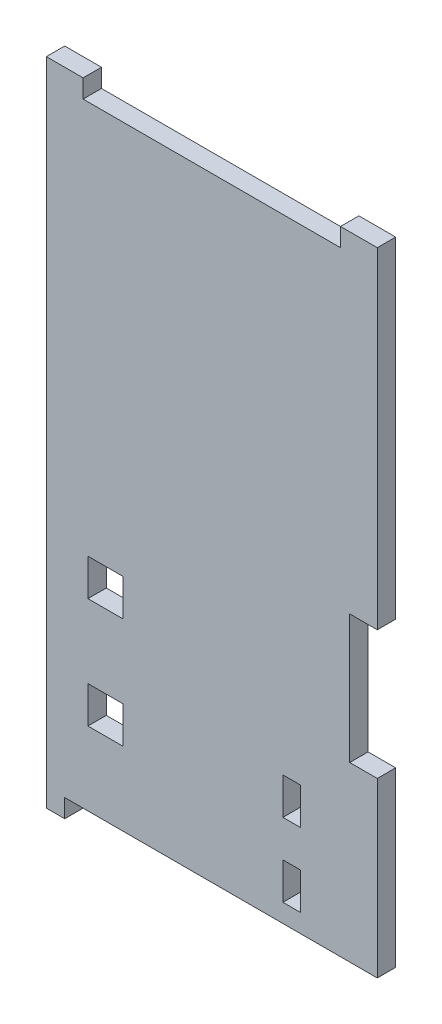
ISO-10303-21;
HEADER;
FILE_DESCRIPTION(('STEP AP214'),'2;1');
FILE_NAME('part.step','',(''),(''),'','','');
FILE_SCHEMA(('AUTOMOTIVE_DESIGN { 1 0 10303 214 1 1 1 1 }'));
ENDSEC;
DATA;
#1=APPLICATION_CONTEXT('core data for automotive mechanical design processes');
#2=APPLICATION_PROTOCOL_DEFINITION('international standard','automotive_design',2000,#1);
#3=PRODUCT_CONTEXT('',#1,'mechanical');
#4=PRODUCT('Part','Part','',(#3));
#5=PRODUCT_RELATED_PRODUCT_CATEGORY('part','',(#4));
#6=PRODUCT_DEFINITION_FORMATION('','',#4);
#7=PRODUCT_DEFINITION_CONTEXT('part definition',#1,'design');
#8=PRODUCT_DEFINITION('design','',#6,#7);
#9=PRODUCT_DEFINITION_SHAPE('','',#8);
#10=(LENGTH_UNIT() NAMED_UNIT(*) SI_UNIT(.MILLI.,.METRE.));
#11=(NAMED_UNIT(*) PLANE_ANGLE_UNIT() SI_UNIT($,.RADIAN.));
#12=(NAMED_UNIT(*) SI_UNIT($,.STERADIAN.) SOLID_ANGLE_UNIT());
#13=UNCERTAINTY_MEASURE_WITH_UNIT(LENGTH_MEASURE(1.E-05),#10,'distance_accuracy_value','');
#14=(GEOMETRIC_REPRESENTATION_CONTEXT(3) GLOBAL_UNCERTAINTY_ASSIGNED_CONTEXT((#13)) GLOBAL_UNIT_ASSIGNED_CONTEXT((#10,
#11,#12)) REPRESENTATION_CONTEXT('',''));
#15=CARTESIAN_POINT('',(0.,0.,0.));
#16=DIRECTION('',(0.,0.,1.));
#17=DIRECTION('',(1.,0.,0.));
#18=AXIS2_PLACEMENT_3D('',#15,#16,#17);
#19=CARTESIAN_POINT('',(0.,0.,5.));
#20=DIRECTION('',(0.,0.,1.));
#21=DIRECTION('',(1.,0.,0.));
#22=AXIS2_PLACEMENT_3D('',#19,#20,#21);
#23=PLANE('',#22);
#24=DIRECTION('',(1.,0.,0.));
#25=VECTOR('',#24,1.);
#26=CARTESIAN_POINT('',(11.3033695588047,19.9999999999951,5.));
#27=LINE('',#26,#25);
#28=CARTESIAN_POINT('',(11.3033695588047,19.9999999999951,5.));
#29=VERTEX_POINT('',#28);
#30=CARTESIAN_POINT('',(20.883176168976,19.9999999999951,5.));
#31=VERTEX_POINT('',#30);
#32=EDGE_CURVE('E268',#29,#31,#27,.T.);
#33=ORIENTED_EDGE('',*,*,#32,.F.);
#34=DIRECTION('',(0.,-1.,0.));
#35=VECTOR('',#34,1.);
#36=CARTESIAN_POINT('',(11.3033695588047,29.9999999999951,5.));
#37=LINE('',#36,#35);
#38=CARTESIAN_POINT('',(11.3033695588047,29.9999999999951,5.));
#39=VERTEX_POINT('',#38);
#40=EDGE_CURVE('E266',#39,#29,#37,.T.);
#41=ORIENTED_EDGE('',*,*,#40,.F.);
#42=DIRECTION('',(-1.,0.,0.));
#43=VECTOR('',#42,1.);
#44=CARTESIAN_POINT('',(11.3033695588047,29.9999999999951,5.));
#45=LINE('',#44,#43);
#46=CARTESIAN_POINT('',(20.883176168976,29.9999999999951,5.));
#47=VERTEX_POINT('',#46);
#48=EDGE_CURVE('E274',#47,#39,#45,.T.);
#49=ORIENTED_EDGE('',*,*,#48,.F.);
#50=DIRECTION('',(0.,1.,0.));
#51=VECTOR('',#50,1.);
#52=CARTESIAN_POINT('',(20.883176168976,29.9999999999951,5.));
#53=LINE('',#52,#51);
#54=EDGE_CURVE('E271',#31,#47,#53,.T.);
#55=ORIENTED_EDGE('',*,*,#54,.F.);
#56=EDGE_LOOP('',(#33,#41,#49,#55));
#57=FACE_BOUND('',#56,.T.);
#58=DIRECTION('',(0.,-1.,0.));
#59=VECTOR('',#58,1.);
#60=CARTESIAN_POINT('',(64.3347547432963,34.9999999999967,5.));
#61=LINE('',#60,#59);
#62=CARTESIAN_POINT('',(64.3347547432963,34.9999999999967,5.));
#63=VERTEX_POINT('',#62);
#64=CARTESIAN_POINT('',(64.3347547432963,24.9999999999967,5.));
#65=VERTEX_POINT('',#64);
#66=EDGE_CURVE('E330',#63,#65,#61,.T.);
#67=ORIENTED_EDGE('',*,*,#66,.F.);
#68=DIRECTION('',(-1.,0.,0.));
#69=VECTOR('',#68,1.);
#70=CARTESIAN_POINT('',(64.3347547432963,34.9999999999967,5.));
#71=LINE('',#70,#69);
#72=CARTESIAN_POINT('',(69.1422875214921,34.9999999999967,5.));
#73=VERTEX_POINT('',#72);
#74=EDGE_CURVE('E328',#73,#63,#71,.T.);
#75=ORIENTED_EDGE('',*,*,#74,.F.);
#76=DIRECTION('',(0.,1.,0.));
#77=VECTOR('',#76,1.);
#78=CARTESIAN_POINT('',(69.1422875214921,34.9999999999967,5.));
#79=LINE('',#78,#77);
#80=CARTESIAN_POINT('',(69.1422875214921,24.9999999999967,5.));
#81=VERTEX_POINT('',#80);
#82=EDGE_CURVE('E336',#81,#73,#79,.T.);
#83=ORIENTED_EDGE('',*,*,#82,.F.);
#84=DIRECTION('',(1.,0.,0.));
#85=VECTOR('',#84,1.);
#86=CARTESIAN_POINT('',(64.3347547432963,24.9999999999967,5.));
#87=LINE('',#86,#85);
#88=EDGE_CURVE('E333',#65,#81,#87,.T.);
#89=ORIENTED_EDGE('',*,*,#88,.F.);
#90=EDGE_LOOP('',(#67,#75,#83,#89));
#91=FACE_BOUND('',#90,.T.);
#92=DIRECTION('',(0.,-1.,0.));
#93=VECTOR('',#92,1.);
#94=CARTESIAN_POINT('',(0.,0.,5.));
#95=LINE('',#94,#93);
#96=CARTESIAN_POINT('',(0.,172.,5.));
#97=VERTEX_POINT('',#96);
#98=CARTESIAN_POINT('',(0.,-5.,5.));
#99=VERTEX_POINT('',#98);
#100=EDGE_CURVE('E359',#97,#99,#95,.T.);
#101=ORIENTED_EDGE('',*,*,#100,.T.);
#102=DIRECTION('',(1.,0.,0.));
#103=VECTOR('',#102,1.);
#104=CARTESIAN_POINT('',(0.,-5.,5.));
#105=LINE('',#104,#103);
#106=CARTESIAN_POINT('',(5.,-5.,5.));
#107=VERTEX_POINT('',#106);
#108=EDGE_CURVE('E362',#99,#107,#105,.T.);
#109=ORIENTED_EDGE('',*,*,#108,.T.);
#110=DIRECTION('',(0.,1.,0.));
#111=VECTOR('',#110,1.);
#112=CARTESIAN_POINT('',(5.,0.,5.));
#113=LINE('',#112,#111);
#114=CARTESIAN_POINT('',(5.,0.,5.));
#115=VERTEX_POINT('',#114);
#116=EDGE_CURVE('E365',#107,#115,#113,.T.);
#117=ORIENTED_EDGE('',*,*,#116,.T.);
#118=DIRECTION('',(1.,0.,0.));
#119=VECTOR('',#118,1.);
#120=CARTESIAN_POINT('',(5.,0.,5.));
#121=LINE('',#120,#119);
#122=CARTESIAN_POINT('',(90.,0.,5.));
#123=VERTEX_POINT('',#122);
#124=EDGE_CURVE('E367',#115,#123,#121,.T.);
#125=ORIENTED_EDGE('',*,*,#124,.T.);
#126=DIRECTION('',(0.,1.,0.));
#127=VECTOR('',#126,1.);
#128=CARTESIAN_POINT('',(90.,0.,5.));
#129=LINE('',#128,#127);
#130=CARTESIAN_POINT('',(90.,47.,5.));
#131=VERTEX_POINT('',#130);
#132=EDGE_CURVE('E369',#123,#131,#129,.T.);
#133=ORIENTED_EDGE('',*,*,#132,.T.);
#134=DIRECTION('',(-1.,0.,0.));
#135=VECTOR('',#134,1.);
#136=CARTESIAN_POINT('',(90.,47.,5.));
#137=LINE('',#136,#135);
#138=CARTESIAN_POINT('',(82.5,47.,5.));
#139=VERTEX_POINT('',#138);
#140=EDGE_CURVE('E371',#131,#139,#137,.T.);
#141=ORIENTED_EDGE('',*,*,#140,.T.);
#142=DIRECTION('',(0.,1.,0.));
#143=VECTOR('',#142,1.);
#144=CARTESIAN_POINT('',(82.5,82.,5.));
#145=LINE('',#144,#143);
#146=CARTESIAN_POINT('',(82.5,82.,5.));
#147=VERTEX_POINT('',#146);
#148=EDGE_CURVE('E373',#139,#147,#145,.T.);
#149=ORIENTED_EDGE('',*,*,#148,.T.);
#150=DIRECTION('',(1.,0.,0.));
#151=VECTOR('',#150,1.);
#152=CARTESIAN_POINT('',(90.,82.,5.));
#153=LINE('',#152,#151);
#154=CARTESIAN_POINT('',(90.,82.,5.));
#155=VERTEX_POINT('',#154);
#156=EDGE_CURVE('E375',#147,#155,#153,.T.);
#157=ORIENTED_EDGE('',*,*,#156,.T.);
#158=DIRECTION('',(0.,1.,0.));
#159=VECTOR('',#158,1.);
#160=CARTESIAN_POINT('',(90.,82.,5.));
#161=LINE('',#160,#159);
#162=CARTESIAN_POINT('',(90.,172.,5.));
#163=VERTEX_POINT('',#162);
#164=EDGE_CURVE('E377',#155,#163,#161,.T.);
#165=ORIENTED_EDGE('',*,*,#164,.T.);
#166=DIRECTION('',(-1.,0.,0.));
#167=VECTOR('',#166,1.);
#168=CARTESIAN_POINT('',(90.,172.,5.));
#169=LINE('',#168,#167);
#170=CARTESIAN_POINT('',(80.,172.,5.));
#171=VERTEX_POINT('',#170);
#172=EDGE_CURVE('E379',#163,#171,#169,.T.);
#173=ORIENTED_EDGE('',*,*,#172,.T.);
#174=DIRECTION('',(0.,-1.,0.));
#175=VECTOR('',#174,1.);
#176=CARTESIAN_POINT('',(80.,167.,5.));
#177=LINE('',#176,#175);
#178=CARTESIAN_POINT('',(80.,167.,5.));
#179=VERTEX_POINT('',#178);
#180=EDGE_CURVE('E381',#171,#179,#177,.T.);
#181=ORIENTED_EDGE('',*,*,#180,.T.);
#182=DIRECTION('',(-1.,0.,0.));
#183=VECTOR('',#182,1.);
#184=CARTESIAN_POINT('',(10.,167.,5.));
#185=LINE('',#184,#183);
#186=CARTESIAN_POINT('',(10.,167.,5.));
#187=VERTEX_POINT('',#186);
#188=EDGE_CURVE('E383',#179,#187,#185,.T.);
#189=ORIENTED_EDGE('',*,*,#188,.T.);
#190=DIRECTION('',(0.,1.,0.));
#191=VECTOR('',#190,1.);
#192=CARTESIAN_POINT('',(10.,167.,5.));
#193=LINE('',#192,#191);
#194=CARTESIAN_POINT('',(10.,172.,5.));
#195=VERTEX_POINT('',#194);
#196=EDGE_CURVE('E385',#187,#195,#193,.T.);
#197=ORIENTED_EDGE('',*,*,#196,.T.);
#198=DIRECTION('',(-1.,0.,0.));
#199=VECTOR('',#198,1.);
#200=CARTESIAN_POINT('',(0.,172.,5.));
#201=LINE('',#200,#199);
#202=EDGE_CURVE('E387',#195,#97,#201,.T.);
#203=ORIENTED_EDGE('',*,*,#202,.T.);
#204=EDGE_LOOP('',(#101,#109,#117,#125,#133,#141,#149,#157,#165,#173,#181,#189,#197,#203));
#205=FACE_BOUND('',#204,.T.);
#206=DIRECTION('',(1.,0.,0.));
#207=VECTOR('',#206,1.);
#208=CARTESIAN_POINT('',(64.3347547432963,4.99999999999675,5.));
#209=LINE('',#208,#207);
#210=CARTESIAN_POINT('',(64.3347547432963,4.99999999999675,5.));
#211=VERTEX_POINT('',#210);
#212=CARTESIAN_POINT('',(69.1422875214921,4.99999999999675,5.));
#213=VERTEX_POINT('',#212);
#214=EDGE_CURVE('E299',#211,#213,#209,.T.);
#215=ORIENTED_EDGE('',*,*,#214,.F.);
#216=DIRECTION('',(0.,-1.,0.));
#217=VECTOR('',#216,1.);
#218=CARTESIAN_POINT('',(64.3347547432963,14.9999999999967,5.));
#219=LINE('',#218,#217);
#220=CARTESIAN_POINT('',(64.3347547432963,14.9999999999967,5.));
#221=VERTEX_POINT('',#220);
#222=EDGE_CURVE('E297',#221,#211,#219,.T.);
#223=ORIENTED_EDGE('',*,*,#222,.F.);
#224=DIRECTION('',(-1.,0.,0.));
#225=VECTOR('',#224,1.);
#226=CARTESIAN_POINT('',(64.3347547432963,14.9999999999967,5.));
#227=LINE('',#226,#225);
#228=CARTESIAN_POINT('',(69.1422875214921,14.9999999999967,5.));
#229=VERTEX_POINT('',#228);
#230=EDGE_CURVE('E305',#229,#221,#227,.T.);
#231=ORIENTED_EDGE('',*,*,#230,.F.);
#232=DIRECTION('',(0.,1.,0.));
#233=VECTOR('',#232,1.);
#234=CARTESIAN_POINT('',(69.1422875214921,14.9999999999967,5.));
#235=LINE('',#234,#233);
#236=EDGE_CURVE('E302',#213,#229,#235,.T.);
#237=ORIENTED_EDGE('',*,*,#236,.F.);
#238=EDGE_LOOP('',(#215,#223,#231,#237));
#239=FACE_BOUND('',#238,.T.);
#240=DIRECTION('',(1.,0.,0.));
#241=VECTOR('',#240,1.);
#242=CARTESIAN_POINT('',(11.3033695588046,49.9999999999951,5.));
#243=LINE('',#242,#241);
#244=CARTESIAN_POINT('',(11.3033695588046,49.9999999999951,5.));
#245=VERTEX_POINT('',#244);
#246=CARTESIAN_POINT('',(20.8831761689759,49.9999999999951,5.));
#247=VERTEX_POINT('',#246);
#248=EDGE_CURVE('E238',#245,#247,#243,.T.);
#249=ORIENTED_EDGE('',*,*,#248,.F.);
#250=DIRECTION('',(0.,-1.,0.));
#251=VECTOR('',#250,1.);
#252=CARTESIAN_POINT('',(11.3033695588046,59.9999999999951,5.));
#253=LINE('',#252,#251);
#254=CARTESIAN_POINT('',(11.3033695588046,59.9999999999951,5.));
#255=VERTEX_POINT('',#254);
#256=EDGE_CURVE('E230',#255,#245,#253,.T.);
#257=ORIENTED_EDGE('',*,*,#256,.F.);
#258=DIRECTION('',(-1.,0.,0.));
#259=VECTOR('',#258,1.);
#260=CARTESIAN_POINT('',(11.3033695588046,59.9999999999951,5.));
#261=LINE('',#260,#259);
#262=CARTESIAN_POINT('',(20.8831761689759,59.9999999999951,5.));
#263=VERTEX_POINT('',#262);
#264=EDGE_CURVE('E252',#263,#255,#261,.T.);
#265=ORIENTED_EDGE('',*,*,#264,.F.);
#266=DIRECTION('',(0.,1.,0.));
#267=VECTOR('',#266,1.);
#268=CARTESIAN_POINT('',(20.8831761689759,59.9999999999951,5.));
#269=LINE('',#268,#267);
#270=EDGE_CURVE('E250',#247,#263,#269,.T.);
#271=ORIENTED_EDGE('',*,*,#270,.F.);
#272=EDGE_LOOP('',(#249,#257,#265,#271));
#273=FACE_BOUND('',#272,.T.);
#274=ADVANCED_FACE('F33',(#57,#91,#205,#239,#273),#23,.T.);
#275=CARTESIAN_POINT('',(0.,0.,0.));
#276=DIRECTION('',(0.,0.,1.));
#277=DIRECTION('',(1.,0.,0.));
#278=AXIS2_PLACEMENT_3D('',#275,#276,#277);
#279=PLANE('',#278);
#280=DIRECTION('',(0.,-1.,0.));
#281=VECTOR('',#280,1.);
#282=CARTESIAN_POINT('',(11.3033695588047,29.9999999999951,0.));
#283=LINE('',#282,#281);
#284=CARTESIAN_POINT('',(11.3033695588047,29.9999999999951,0.));
#285=VERTEX_POINT('',#284);
#286=CARTESIAN_POINT('',(11.3033695588047,19.9999999999951,0.));
#287=VERTEX_POINT('',#286);
#288=EDGE_CURVE('E246',#285,#287,#283,.T.);
#289=ORIENTED_EDGE('',*,*,#288,.T.);
#290=DIRECTION('',(1.,0.,0.));
#291=VECTOR('',#290,1.);
#292=CARTESIAN_POINT('',(11.3033695588047,19.9999999999951,0.));
#293=LINE('',#292,#291);
#294=CARTESIAN_POINT('',(20.883176168976,19.9999999999951,0.));
#295=VERTEX_POINT('',#294);
#296=EDGE_CURVE('E279',#287,#295,#293,.T.);
#297=ORIENTED_EDGE('',*,*,#296,.T.);
#298=DIRECTION('',(0.,1.,0.));
#299=VECTOR('',#298,1.);
#300=CARTESIAN_POINT('',(20.883176168976,29.9999999999951,0.));
#301=LINE('',#300,#299);
#302=CARTESIAN_POINT('',(20.883176168976,29.9999999999951,0.));
#303=VERTEX_POINT('',#302);
#304=EDGE_CURVE('E282',#295,#303,#301,.T.);
#305=ORIENTED_EDGE('',*,*,#304,.T.);
#306=DIRECTION('',(-1.,0.,0.));
#307=VECTOR('',#306,1.);
#308=CARTESIAN_POINT('',(11.3033695588047,29.9999999999951,0.));
#309=LINE('',#308,#307);
#310=EDGE_CURVE('E269',#303,#285,#309,.T.);
#311=ORIENTED_EDGE('',*,*,#310,.T.);
#312=EDGE_LOOP('',(#289,#297,#305,#311));
#313=FACE_BOUND('',#312,.T.);
#314=DIRECTION('',(-1.,0.,0.));
#315=VECTOR('',#314,1.);
#316=CARTESIAN_POINT('',(64.3347547432963,34.9999999999967,0.));
#317=LINE('',#316,#315);
#318=CARTESIAN_POINT('',(69.1422875214921,34.9999999999967,0.));
#319=VERTEX_POINT('',#318);
#320=CARTESIAN_POINT('',(64.3347547432963,34.9999999999967,0.));
#321=VERTEX_POINT('',#320);
#322=EDGE_CURVE('E327',#319,#321,#317,.T.);
#323=ORIENTED_EDGE('',*,*,#322,.T.);
#324=DIRECTION('',(0.,-1.,0.));
#325=VECTOR('',#324,1.);
#326=CARTESIAN_POINT('',(64.3347547432963,34.9999999999967,0.));
#327=LINE('',#326,#325);
#328=CARTESIAN_POINT('',(64.3347547432963,24.9999999999967,0.));
#329=VERTEX_POINT('',#328);
#330=EDGE_CURVE('E341',#321,#329,#327,.T.);
#331=ORIENTED_EDGE('',*,*,#330,.T.);
#332=DIRECTION('',(1.,0.,0.));
#333=VECTOR('',#332,1.);
#334=CARTESIAN_POINT('',(64.3347547432963,24.9999999999967,0.));
#335=LINE('',#334,#333);
#336=CARTESIAN_POINT('',(69.1422875214921,24.9999999999967,0.));
#337=VERTEX_POINT('',#336);
#338=EDGE_CURVE('E344',#329,#337,#335,.T.);
#339=ORIENTED_EDGE('',*,*,#338,.T.);
#340=DIRECTION('',(0.,1.,0.));
#341=VECTOR('',#340,1.);
#342=CARTESIAN_POINT('',(69.1422875214921,34.9999999999967,0.));
#343=LINE('',#342,#341);
#344=EDGE_CURVE('E331',#337,#319,#343,.T.);
#345=ORIENTED_EDGE('',*,*,#344,.T.);
#346=EDGE_LOOP('',(#323,#331,#339,#345));
#347=FACE_BOUND('',#346,.T.);
#348=DIRECTION('',(1.,0.,0.));
#349=VECTOR('',#348,1.);
#350=CARTESIAN_POINT('',(0.,-5.,0.));
#351=LINE('',#350,#349);
#352=CARTESIAN_POINT('',(0.,-5.,0.));
#353=VERTEX_POINT('',#352);
#354=CARTESIAN_POINT('',(5.,-5.,0.));
#355=VERTEX_POINT('',#354);
#356=EDGE_CURVE('E358',#353,#355,#351,.T.);
#357=ORIENTED_EDGE('',*,*,#356,.F.);
#358=DIRECTION('',(0.,-1.,0.));
#359=VECTOR('',#358,1.);
#360=CARTESIAN_POINT('',(0.,0.,0.));
#361=LINE('',#360,#359);
#362=CARTESIAN_POINT('',(0.,172.,0.));
#363=VERTEX_POINT('',#362);
#364=EDGE_CURVE('E363',#363,#353,#361,.T.);
#365=ORIENTED_EDGE('',*,*,#364,.F.);
#366=DIRECTION('',(-1.,0.,0.));
#367=VECTOR('',#366,1.);
#368=CARTESIAN_POINT('',(0.,172.,0.));
#369=LINE('',#368,#367);
#370=CARTESIAN_POINT('',(10.,172.,0.));
#371=VERTEX_POINT('',#370);
#372=EDGE_CURVE('E415',#371,#363,#369,.T.);
#373=ORIENTED_EDGE('',*,*,#372,.F.);
#374=DIRECTION('',(0.,1.,0.));
#375=VECTOR('',#374,1.);
#376=CARTESIAN_POINT('',(10.,167.,0.));
#377=LINE('',#376,#375);
#378=CARTESIAN_POINT('',(10.,167.,0.));
#379=VERTEX_POINT('',#378);
#380=EDGE_CURVE('E413',#379,#371,#377,.T.);
#381=ORIENTED_EDGE('',*,*,#380,.F.);
#382=DIRECTION('',(-1.,0.,0.));
#383=VECTOR('',#382,1.);
#384=CARTESIAN_POINT('',(10.,167.,0.));
#385=LINE('',#384,#383);
#386=CARTESIAN_POINT('',(80.,167.,0.));
#387=VERTEX_POINT('',#386);
#388=EDGE_CURVE('E411',#387,#379,#385,.T.);
#389=ORIENTED_EDGE('',*,*,#388,.F.);
#390=DIRECTION('',(0.,-1.,0.));
#391=VECTOR('',#390,1.);
#392=CARTESIAN_POINT('',(80.,167.,0.));
#393=LINE('',#392,#391);
#394=CARTESIAN_POINT('',(80.,172.,0.));
#395=VERTEX_POINT('',#394);
#396=EDGE_CURVE('E409',#395,#387,#393,.T.);
#397=ORIENTED_EDGE('',*,*,#396,.F.);
#398=DIRECTION('',(-1.,0.,0.));
#399=VECTOR('',#398,1.);
#400=CARTESIAN_POINT('',(90.,172.,0.));
#401=LINE('',#400,#399);
#402=CARTESIAN_POINT('',(90.,172.,0.));
#403=VERTEX_POINT('',#402);
#404=EDGE_CURVE('E407',#403,#395,#401,.T.);
#405=ORIENTED_EDGE('',*,*,#404,.F.);
#406=DIRECTION('',(0.,1.,0.));
#407=VECTOR('',#406,1.);
#408=CARTESIAN_POINT('',(90.,167.,0.));
#409=LINE('',#408,#407);
#410=CARTESIAN_POINT('',(90.,82.,0.));
#411=VERTEX_POINT('',#410);
#412=EDGE_CURVE('E405',#411,#403,#409,.T.);
#413=ORIENTED_EDGE('',*,*,#412,.F.);
#414=DIRECTION('',(1.,0.,0.));
#415=VECTOR('',#414,1.);
#416=CARTESIAN_POINT('',(90.,82.,0.));
#417=LINE('',#416,#415);
#418=CARTESIAN_POINT('',(82.5,82.,0.));
#419=VERTEX_POINT('',#418);
#420=EDGE_CURVE('E402',#419,#411,#417,.T.);
#421=ORIENTED_EDGE('',*,*,#420,.F.);
#422=DIRECTION('',(0.,1.,0.));
#423=VECTOR('',#422,1.);
#424=CARTESIAN_POINT('',(82.5,82.,0.));
#425=LINE('',#424,#423);
#426=CARTESIAN_POINT('',(82.5,47.,0.));
#427=VERTEX_POINT('',#426);
#428=EDGE_CURVE('E400',#427,#419,#425,.T.);
#429=ORIENTED_EDGE('',*,*,#428,.F.);
#430=DIRECTION('',(-1.,0.,0.));
#431=VECTOR('',#430,1.);
#432=CARTESIAN_POINT('',(90.,47.,0.));
#433=LINE('',#432,#431);
#434=CARTESIAN_POINT('',(90.,47.,0.));
#435=VERTEX_POINT('',#434);
#436=EDGE_CURVE('E398',#435,#427,#433,.T.);
#437=ORIENTED_EDGE('',*,*,#436,.F.);
#438=DIRECTION('',(0.,1.,0.));
#439=VECTOR('',#438,1.);
#440=CARTESIAN_POINT('',(90.,0.,0.));
#441=LINE('',#440,#439);
#442=CARTESIAN_POINT('',(90.,0.,0.));
#443=VERTEX_POINT('',#442);
#444=EDGE_CURVE('E396',#443,#435,#441,.T.);
#445=ORIENTED_EDGE('',*,*,#444,.F.);
#446=DIRECTION('',(1.,0.,0.));
#447=VECTOR('',#446,1.);
#448=CARTESIAN_POINT('',(5.,0.,0.));
#449=LINE('',#448,#447);
#450=CARTESIAN_POINT('',(5.,0.,0.));
#451=VERTEX_POINT('',#450);
#452=EDGE_CURVE('E394',#451,#443,#449,.T.);
#453=ORIENTED_EDGE('',*,*,#452,.F.);
#454=DIRECTION('',(0.,1.,0.));
#455=VECTOR('',#454,1.);
#456=CARTESIAN_POINT('',(5.,0.,0.));
#457=LINE('',#456,#455);
#458=EDGE_CURVE('E392',#355,#451,#457,.T.);
#459=ORIENTED_EDGE('',*,*,#458,.F.);
#460=EDGE_LOOP('',(#357,#365,#373,#381,#389,#397,#405,#413,#421,#429,#437,#445,#453,#459));
#461=FACE_BOUND('',#460,.T.);
#462=DIRECTION('',(0.,-1.,0.));
#463=VECTOR('',#462,1.);
#464=CARTESIAN_POINT('',(64.3347547432963,14.9999999999967,0.));
#465=LINE('',#464,#463);
#466=CARTESIAN_POINT('',(64.3347547432963,14.9999999999967,0.));
#467=VERTEX_POINT('',#466);
#468=CARTESIAN_POINT('',(64.3347547432963,4.99999999999675,0.));
#469=VERTEX_POINT('',#468);
#470=EDGE_CURVE('E296',#467,#469,#465,.T.);
#471=ORIENTED_EDGE('',*,*,#470,.T.);
#472=DIRECTION('',(1.,0.,0.));
#473=VECTOR('',#472,1.);
#474=CARTESIAN_POINT('',(64.3347547432963,4.99999999999675,0.));
#475=LINE('',#474,#473);
#476=CARTESIAN_POINT('',(69.1422875214921,4.99999999999675,0.));
#477=VERTEX_POINT('',#476);
#478=EDGE_CURVE('E310',#469,#477,#475,.T.);
#479=ORIENTED_EDGE('',*,*,#478,.T.);
#480=DIRECTION('',(0.,1.,0.));
#481=VECTOR('',#480,1.);
#482=CARTESIAN_POINT('',(69.1422875214921,14.9999999999967,0.));
#483=LINE('',#482,#481);
#484=CARTESIAN_POINT('',(69.1422875214921,14.9999999999967,0.));
#485=VERTEX_POINT('',#484);
#486=EDGE_CURVE('E313',#477,#485,#483,.T.);
#487=ORIENTED_EDGE('',*,*,#486,.T.);
#488=DIRECTION('',(-1.,0.,0.));
#489=VECTOR('',#488,1.);
#490=CARTESIAN_POINT('',(64.3347547432963,14.9999999999967,0.));
#491=LINE('',#490,#489);
#492=EDGE_CURVE('E300',#485,#467,#491,.T.);
#493=ORIENTED_EDGE('',*,*,#492,.T.);
#494=EDGE_LOOP('',(#471,#479,#487,#493));
#495=FACE_BOUND('',#494,.T.);
#496=DIRECTION('',(0.,-1.,0.));
#497=VECTOR('',#496,1.);
#498=CARTESIAN_POINT('',(11.3033695588046,59.9999999999951,0.));
#499=LINE('',#498,#497);
#500=CARTESIAN_POINT('',(11.3033695588046,59.9999999999951,0.));
#501=VERTEX_POINT('',#500);
#502=CARTESIAN_POINT('',(11.3033695588046,49.9999999999951,0.));
#503=VERTEX_POINT('',#502);
#504=EDGE_CURVE('E56',#501,#503,#499,.T.);
#505=ORIENTED_EDGE('',*,*,#504,.T.);
#506=DIRECTION('',(1.,0.,0.));
#507=VECTOR('',#506,1.);
#508=CARTESIAN_POINT('',(11.3033695588046,49.9999999999951,0.));
#509=LINE('',#508,#507);
#510=CARTESIAN_POINT('',(20.8831761689759,49.9999999999951,0.));
#511=VERTEX_POINT('',#510);
#512=EDGE_CURVE('E245',#503,#511,#509,.T.);
#513=ORIENTED_EDGE('',*,*,#512,.T.);
#514=DIRECTION('',(0.,1.,0.));
#515=VECTOR('',#514,1.);
#516=CARTESIAN_POINT('',(20.8831761689759,59.9999999999951,0.));
#517=LINE('',#516,#515);
#518=CARTESIAN_POINT('',(20.8831761689759,59.9999999999951,0.));
#519=VERTEX_POINT('',#518);
#520=EDGE_CURVE('E258',#511,#519,#517,.T.);
#521=ORIENTED_EDGE('',*,*,#520,.T.);
#522=DIRECTION('',(-1.,0.,0.));
#523=VECTOR('',#522,1.);
#524=CARTESIAN_POINT('',(11.3033695588046,59.9999999999951,0.));
#525=LINE('',#524,#523);
#526=EDGE_CURVE('E239',#519,#501,#525,.T.);
#527=ORIENTED_EDGE('',*,*,#526,.T.);
#528=EDGE_LOOP('',(#505,#513,#521,#527));
#529=FACE_BOUND('',#528,.T.);
#530=ADVANCED_FACE('F464',(#313,#347,#461,#495,#529),#279,.F.);
#531=CARTESIAN_POINT('',(0.,-5.,5.));
#532=DIRECTION('',(0.,1.,0.));
#533=DIRECTION('',(0.,0.,1.));
#534=AXIS2_PLACEMENT_3D('',#531,#532,#533);
#535=PLANE('',#534);
#536=ORIENTED_EDGE('',*,*,#356,.T.);
#537=DIRECTION('',(0.,0.,-1.));
#538=VECTOR('',#537,1.);
#539=CARTESIAN_POINT('',(5.,-5.,5.));
#540=LINE('',#539,#538);
#541=EDGE_CURVE('E41',#107,#355,#540,.T.);
#542=ORIENTED_EDGE('',*,*,#541,.F.);
#543=ORIENTED_EDGE('',*,*,#108,.F.);
#544=DIRECTION('',(0.,0.,-1.));
#545=VECTOR('',#544,1.);
#546=CARTESIAN_POINT('',(0.,-5.,5.));
#547=LINE('',#546,#545);
#548=EDGE_CURVE('E11',#99,#353,#547,.T.);
#549=ORIENTED_EDGE('',*,*,#548,.T.);
#550=EDGE_LOOP('',(#536,#542,#543,#549));
#551=FACE_BOUND('',#550,.T.);
#552=ADVANCED_FACE('F35',(#551),#535,.F.);
#553=CARTESIAN_POINT('',(5.,0.,5.));
#554=DIRECTION('',(-1.,0.,0.));
#555=DIRECTION('',(0.,-1.,0.));
#556=AXIS2_PLACEMENT_3D('',#553,#554,#555);
#557=PLANE('',#556);
#558=ORIENTED_EDGE('',*,*,#458,.T.);
#559=DIRECTION('',(0.,0.,-1.));
#560=VECTOR('',#559,1.);
#561=CARTESIAN_POINT('',(5.,0.,5.));
#562=LINE('',#561,#560);
#563=EDGE_CURVE('E451',#115,#451,#562,.T.);
#564=ORIENTED_EDGE('',*,*,#563,.F.);
#565=ORIENTED_EDGE('',*,*,#116,.F.);
#566=ORIENTED_EDGE('',*,*,#541,.T.);
#567=EDGE_LOOP('',(#558,#564,#565,#566));
#568=FACE_BOUND('',#567,.T.);
#569=ADVANCED_FACE('F458',(#568),#557,.F.);
#570=CARTESIAN_POINT('',(5.,0.,5.));
#571=DIRECTION('',(0.,1.,0.));
#572=DIRECTION('',(0.,0.,1.));
#573=AXIS2_PLACEMENT_3D('',#570,#571,#572);
#574=PLANE('',#573);
#575=ORIENTED_EDGE('',*,*,#452,.T.);
#576=DIRECTION('',(0.,0.,-1.));
#577=VECTOR('',#576,1.);
#578=CARTESIAN_POINT('',(90.,0.,5.));
#579=LINE('',#578,#577);
#580=EDGE_CURVE('E448',#123,#443,#579,.T.);
#581=ORIENTED_EDGE('',*,*,#580,.F.);
#582=ORIENTED_EDGE('',*,*,#124,.F.);
#583=ORIENTED_EDGE('',*,*,#563,.T.);
#584=EDGE_LOOP('',(#575,#581,#582,#583));
#585=FACE_BOUND('',#584,.T.);
#586=ADVANCED_FACE('F470',(#585),#574,.F.);
#587=CARTESIAN_POINT('',(90.,0.,5.));
#588=DIRECTION('',(-1.,0.,0.));
#589=DIRECTION('',(0.,0.,1.));
#590=AXIS2_PLACEMENT_3D('',#587,#588,#589);
#591=PLANE('',#590);
#592=ORIENTED_EDGE('',*,*,#444,.T.);
#593=DIRECTION('',(0.,0.,-1.));
#594=VECTOR('',#593,1.);
#595=CARTESIAN_POINT('',(90.,47.,5.));
#596=LINE('',#595,#594);
#597=EDGE_CURVE('E445',#131,#435,#596,.T.);
#598=ORIENTED_EDGE('',*,*,#597,.F.);
#599=ORIENTED_EDGE('',*,*,#132,.F.);
#600=ORIENTED_EDGE('',*,*,#580,.T.);
#601=EDGE_LOOP('',(#592,#598,#599,#600));
#602=FACE_BOUND('',#601,.T.);
#603=ADVANCED_FACE('F474',(#602),#591,.F.);
#604=CARTESIAN_POINT('',(90.,47.,5.));
#605=DIRECTION('',(0.,-1.,0.));
#606=DIRECTION('',(0.,0.,-1.));
#607=AXIS2_PLACEMENT_3D('',#604,#605,#606);
#608=PLANE('',#607);
#609=ORIENTED_EDGE('',*,*,#436,.T.);
#610=DIRECTION('',(0.,0.,-1.));
#611=VECTOR('',#610,1.);
#612=CARTESIAN_POINT('',(82.5,47.,5.));
#613=LINE('',#612,#611);
#614=EDGE_CURVE('E442',#139,#427,#613,.T.);
#615=ORIENTED_EDGE('',*,*,#614,.F.);
#616=ORIENTED_EDGE('',*,*,#140,.F.);
#617=ORIENTED_EDGE('',*,*,#597,.T.);
#618=EDGE_LOOP('',(#609,#615,#616,#617));
#619=FACE_BOUND('',#618,.T.);
#620=ADVANCED_FACE('F523',(#619),#608,.F.);
#621=CARTESIAN_POINT('',(82.5,82.,5.));
#622=DIRECTION('',(-1.,0.,0.));
#623=DIRECTION('',(0.,0.,1.));
#624=AXIS2_PLACEMENT_3D('',#621,#622,#623);
#625=PLANE('',#624);
#626=ORIENTED_EDGE('',*,*,#428,.T.);
#627=DIRECTION('',(0.,0.,-1.));
#628=VECTOR('',#627,1.);
#629=CARTESIAN_POINT('',(82.5,82.,5.));
#630=LINE('',#629,#628);
#631=EDGE_CURVE('E439',#147,#419,#630,.T.);
#632=ORIENTED_EDGE('',*,*,#631,.F.);
#633=ORIENTED_EDGE('',*,*,#148,.F.);
#634=ORIENTED_EDGE('',*,*,#614,.T.);
#635=EDGE_LOOP('',(#626,#632,#633,#634));
#636=FACE_BOUND('',#635,.T.);
#637=ADVANCED_FACE('F521',(#636),#625,.F.);
#638=CARTESIAN_POINT('',(90.,82.,5.));
#639=DIRECTION('',(0.,1.,0.));
#640=DIRECTION('',(0.,0.,1.));
#641=AXIS2_PLACEMENT_3D('',#638,#639,#640);
#642=PLANE('',#641);
#643=ORIENTED_EDGE('',*,*,#420,.T.);
#644=DIRECTION('',(0.,0.,-1.));
#645=VECTOR('',#644,1.);
#646=CARTESIAN_POINT('',(90.,82.,5.));
#647=LINE('',#646,#645);
#648=EDGE_CURVE('E436',#155,#411,#647,.T.);
#649=ORIENTED_EDGE('',*,*,#648,.F.);
#650=ORIENTED_EDGE('',*,*,#156,.F.);
#651=ORIENTED_EDGE('',*,*,#631,.T.);
#652=EDGE_LOOP('',(#643,#649,#650,#651));
#653=FACE_BOUND('',#652,.T.);
#654=ADVANCED_FACE('F514',(#653),#642,.F.);
#655=CARTESIAN_POINT('',(90.,167.,5.));
#656=DIRECTION('',(-1.,0.,0.));
#657=DIRECTION('',(0.,0.,1.));
#658=AXIS2_PLACEMENT_3D('',#655,#656,#657);
#659=PLANE('',#658);
#660=ORIENTED_EDGE('',*,*,#412,.T.);
#661=DIRECTION('',(0.,0.,-1.));
#662=VECTOR('',#661,1.);
#663=CARTESIAN_POINT('',(90.,172.,5.));
#664=LINE('',#663,#662);
#665=EDGE_CURVE('E433',#163,#403,#664,.T.);
#666=ORIENTED_EDGE('',*,*,#665,.F.);
#667=ORIENTED_EDGE('',*,*,#164,.F.);
#668=ORIENTED_EDGE('',*,*,#648,.T.);
#669=EDGE_LOOP('',(#660,#666,#667,#668));
#670=FACE_BOUND('',#669,.T.);
#671=ADVANCED_FACE('F518',(#670),#659,.F.);
#672=CARTESIAN_POINT('',(90.,172.,5.));
#673=DIRECTION('',(0.,-1.,0.));
#674=DIRECTION('',(0.,0.,-1.));
#675=AXIS2_PLACEMENT_3D('',#672,#673,#674);
#676=PLANE('',#675);
#677=ORIENTED_EDGE('',*,*,#404,.T.);
#678=DIRECTION('',(0.,0.,-1.));
#679=VECTOR('',#678,1.);
#680=CARTESIAN_POINT('',(80.,172.,5.));
#681=LINE('',#680,#679);
#682=EDGE_CURVE('E430',#171,#395,#681,.T.);
#683=ORIENTED_EDGE('',*,*,#682,.F.);
#684=ORIENTED_EDGE('',*,*,#172,.F.);
#685=ORIENTED_EDGE('',*,*,#665,.T.);
#686=EDGE_LOOP('',(#677,#683,#684,#685));
#687=FACE_BOUND('',#686,.T.);
#688=ADVANCED_FACE('F507',(#687),#676,.F.);
#689=CARTESIAN_POINT('',(80.,167.,5.));
#690=DIRECTION('',(1.,0.,0.));
#691=DIRECTION('',(0.,0.,-1.));
#692=AXIS2_PLACEMENT_3D('',#689,#690,#691);
#693=PLANE('',#692);
#694=ORIENTED_EDGE('',*,*,#396,.T.);
#695=DIRECTION('',(0.,0.,-1.));
#696=VECTOR('',#695,1.);
#697=CARTESIAN_POINT('',(80.,167.,5.));
#698=LINE('',#697,#696);
#699=EDGE_CURVE('E427',#179,#387,#698,.T.);
#700=ORIENTED_EDGE('',*,*,#699,.F.);
#701=ORIENTED_EDGE('',*,*,#180,.F.);
#702=ORIENTED_EDGE('',*,*,#682,.T.);
#703=EDGE_LOOP('',(#694,#700,#701,#702));
#704=FACE_BOUND('',#703,.T.);
#705=ADVANCED_FACE('F503',(#704),#693,.F.);
#706=CARTESIAN_POINT('',(10.,167.,5.));
#707=DIRECTION('',(0.,-1.,0.));
#708=DIRECTION('',(0.,0.,-1.));
#709=AXIS2_PLACEMENT_3D('',#706,#707,#708);
#710=PLANE('',#709);
#711=ORIENTED_EDGE('',*,*,#388,.T.);
#712=DIRECTION('',(0.,0.,-1.));
#713=VECTOR('',#712,1.);
#714=CARTESIAN_POINT('',(10.,167.,5.));
#715=LINE('',#714,#713);
#716=EDGE_CURVE('E424',#187,#379,#715,.T.);
#717=ORIENTED_EDGE('',*,*,#716,.F.);
#718=ORIENTED_EDGE('',*,*,#188,.F.);
#719=ORIENTED_EDGE('',*,*,#699,.T.);
#720=EDGE_LOOP('',(#711,#717,#718,#719));
#721=FACE_BOUND('',#720,.T.);
#722=ADVANCED_FACE('F498',(#721),#710,.F.);
#723=CARTESIAN_POINT('',(10.,167.,5.));
#724=DIRECTION('',(-1.,0.,0.));
#725=DIRECTION('',(0.,0.,1.));
#726=AXIS2_PLACEMENT_3D('',#723,#724,#725);
#727=PLANE('',#726);
#728=ORIENTED_EDGE('',*,*,#380,.T.);
#729=DIRECTION('',(0.,0.,-1.));
#730=VECTOR('',#729,1.);
#731=CARTESIAN_POINT('',(10.,172.,5.));
#732=LINE('',#731,#730);
#733=EDGE_CURVE('E421',#195,#371,#732,.T.);
#734=ORIENTED_EDGE('',*,*,#733,.F.);
#735=ORIENTED_EDGE('',*,*,#196,.F.);
#736=ORIENTED_EDGE('',*,*,#716,.T.);
#737=EDGE_LOOP('',(#728,#734,#735,#736));
#738=FACE_BOUND('',#737,.T.);
#739=ADVANCED_FACE('F492',(#738),#727,.F.);
#740=CARTESIAN_POINT('',(0.,172.,5.));
#741=DIRECTION('',(0.,-1.,0.));
#742=DIRECTION('',(0.,0.,-1.));
#743=AXIS2_PLACEMENT_3D('',#740,#741,#742);
#744=PLANE('',#743);
#745=ORIENTED_EDGE('',*,*,#372,.T.);
#746=DIRECTION('',(0.,0.,-1.));
#747=VECTOR('',#746,1.);
#748=CARTESIAN_POINT('',(0.,172.,5.));
#749=LINE('',#748,#747);
#750=EDGE_CURVE('E390',#97,#363,#749,.T.);
#751=ORIENTED_EDGE('',*,*,#750,.F.);
#752=ORIENTED_EDGE('',*,*,#202,.F.);
#753=ORIENTED_EDGE('',*,*,#733,.T.);
#754=EDGE_LOOP('',(#745,#751,#752,#753));
#755=FACE_BOUND('',#754,.T.);
#756=ADVANCED_FACE('F487',(#755),#744,.F.);
#757=CARTESIAN_POINT('',(0.,0.,5.));
#758=DIRECTION('',(1.,0.,0.));
#759=DIRECTION('',(0.,0.,-1.));
#760=AXIS2_PLACEMENT_3D('',#757,#758,#759);
#761=PLANE('',#760);
#762=ORIENTED_EDGE('',*,*,#364,.T.);
#763=ORIENTED_EDGE('',*,*,#548,.F.);
#764=ORIENTED_EDGE('',*,*,#100,.F.);
#765=ORIENTED_EDGE('',*,*,#750,.T.);
#766=EDGE_LOOP('',(#762,#763,#764,#765));
#767=FACE_BOUND('',#766,.T.);
#768=ADVANCED_FACE('F482',(#767),#761,.F.);
#769=CARTESIAN_POINT('',(64.3347547432963,34.9999999999967,5.));
#770=DIRECTION('',(0.,-1.,0.));
#771=DIRECTION('',(0.,0.,-1.));
#772=AXIS2_PLACEMENT_3D('',#769,#770,#771);
#773=PLANE('',#772);
#774=ORIENTED_EDGE('',*,*,#322,.F.);
#775=DIRECTION('',(0.,0.,-1.));
#776=VECTOR('',#775,1.);
#777=CARTESIAN_POINT('',(69.1422875214921,34.9999999999967,5.));
#778=LINE('',#777,#776);
#779=EDGE_CURVE('E338',#73,#319,#778,.T.);
#780=ORIENTED_EDGE('',*,*,#779,.F.);
#781=ORIENTED_EDGE('',*,*,#74,.T.);
#782=DIRECTION('',(0.,0.,-1.));
#783=VECTOR('',#782,1.);
#784=CARTESIAN_POINT('',(64.3347547432963,34.9999999999967,5.));
#785=LINE('',#784,#783);
#786=EDGE_CURVE('E355',#63,#321,#785,.T.);
#787=ORIENTED_EDGE('',*,*,#786,.T.);
#788=EDGE_LOOP('',(#774,#780,#781,#787));
#789=FACE_BOUND('',#788,.T.);
#790=ADVANCED_FACE('F543',(#789),#773,.T.);
#791=CARTESIAN_POINT('',(64.3347547432963,34.9999999999967,5.));
#792=DIRECTION('',(1.,0.,0.));
#793=DIRECTION('',(0.,0.,-1.));
#794=AXIS2_PLACEMENT_3D('',#791,#792,#793);
#795=PLANE('',#794);
#796=ORIENTED_EDGE('',*,*,#330,.F.);
#797=ORIENTED_EDGE('',*,*,#786,.F.);
#798=ORIENTED_EDGE('',*,*,#66,.T.);
#799=DIRECTION('',(0.,0.,-1.));
#800=VECTOR('',#799,1.);
#801=CARTESIAN_POINT('',(64.3347547432963,24.9999999999967,5.));
#802=LINE('',#801,#800);
#803=EDGE_CURVE('E353',#65,#329,#802,.T.);
#804=ORIENTED_EDGE('',*,*,#803,.T.);
#805=EDGE_LOOP('',(#796,#797,#798,#804));
#806=FACE_BOUND('',#805,.T.);
#807=ADVANCED_FACE('F599',(#806),#795,.T.);
#808=CARTESIAN_POINT('',(64.3347547432963,24.9999999999967,5.));
#809=DIRECTION('',(0.,1.,0.));
#810=DIRECTION('',(0.,0.,1.));
#811=AXIS2_PLACEMENT_3D('',#808,#809,#810);
#812=PLANE('',#811);
#813=ORIENTED_EDGE('',*,*,#338,.F.);
#814=ORIENTED_EDGE('',*,*,#803,.F.);
#815=ORIENTED_EDGE('',*,*,#88,.T.);
#816=DIRECTION('',(0.,0.,-1.));
#817=VECTOR('',#816,1.);
#818=CARTESIAN_POINT('',(69.1422875214921,24.9999999999967,5.));
#819=LINE('',#818,#817);
#820=EDGE_CURVE('E351',#81,#337,#819,.T.);
#821=ORIENTED_EDGE('',*,*,#820,.T.);
#822=EDGE_LOOP('',(#813,#814,#815,#821));
#823=FACE_BOUND('',#822,.T.);
#824=ADVANCED_FACE('F606',(#823),#812,.T.);
#825=CARTESIAN_POINT('',(69.1422875214921,34.9999999999967,5.));
#826=DIRECTION('',(-1.,0.,0.));
#827=DIRECTION('',(0.,0.,1.));
#828=AXIS2_PLACEMENT_3D('',#825,#826,#827);
#829=PLANE('',#828);
#830=ORIENTED_EDGE('',*,*,#344,.F.);
#831=ORIENTED_EDGE('',*,*,#820,.F.);
#832=ORIENTED_EDGE('',*,*,#82,.T.);
#833=ORIENTED_EDGE('',*,*,#779,.T.);
#834=EDGE_LOOP('',(#830,#831,#832,#833));
#835=FACE_BOUND('',#834,.T.);
#836=ADVANCED_FACE('F613',(#835),#829,.T.);
#837=CARTESIAN_POINT('',(64.3347547432963,14.9999999999967,5.));
#838=DIRECTION('',(1.,0.,0.));
#839=DIRECTION('',(0.,0.,-1.));
#840=AXIS2_PLACEMENT_3D('',#837,#838,#839);
#841=PLANE('',#840);
#842=ORIENTED_EDGE('',*,*,#470,.F.);
#843=DIRECTION('',(0.,0.,-1.));
#844=VECTOR('',#843,1.);
#845=CARTESIAN_POINT('',(64.3347547432963,14.9999999999967,5.));
#846=LINE('',#845,#844);
#847=EDGE_CURVE('E307',#221,#467,#846,.T.);
#848=ORIENTED_EDGE('',*,*,#847,.F.);
#849=ORIENTED_EDGE('',*,*,#222,.T.);
#850=DIRECTION('',(0.,0.,-1.));
#851=VECTOR('',#850,1.);
#852=CARTESIAN_POINT('',(64.3347547432963,4.99999999999675,5.));
#853=LINE('',#852,#851);
#854=EDGE_CURVE('E324',#211,#469,#853,.T.);
#855=ORIENTED_EDGE('',*,*,#854,.T.);
#856=EDGE_LOOP('',(#842,#848,#849,#855));
#857=FACE_BOUND('',#856,.T.);
#858=ADVANCED_FACE('F621',(#857),#841,.T.);
#859=CARTESIAN_POINT('',(64.3347547432963,4.99999999999675,5.));
#860=DIRECTION('',(0.,1.,0.));
#861=DIRECTION('',(0.,0.,1.));
#862=AXIS2_PLACEMENT_3D('',#859,#860,#861);
#863=PLANE('',#862);
#864=ORIENTED_EDGE('',*,*,#478,.F.);
#865=ORIENTED_EDGE('',*,*,#854,.F.);
#866=ORIENTED_EDGE('',*,*,#214,.T.);
#867=DIRECTION('',(0.,0.,-1.));
#868=VECTOR('',#867,1.);
#869=CARTESIAN_POINT('',(69.1422875214921,4.99999999999675,5.));
#870=LINE('',#869,#868);
#871=EDGE_CURVE('E322',#213,#477,#870,.T.);
#872=ORIENTED_EDGE('',*,*,#871,.T.);
#873=EDGE_LOOP('',(#864,#865,#866,#872));
#874=FACE_BOUND('',#873,.T.);
#875=ADVANCED_FACE('F629',(#874),#863,.T.);
#876=CARTESIAN_POINT('',(69.1422875214921,14.9999999999967,5.));
#877=DIRECTION('',(-1.,0.,0.));
#878=DIRECTION('',(0.,0.,1.));
#879=AXIS2_PLACEMENT_3D('',#876,#877,#878);
#880=PLANE('',#879);
#881=ORIENTED_EDGE('',*,*,#486,.F.);
#882=ORIENTED_EDGE('',*,*,#871,.F.);
#883=ORIENTED_EDGE('',*,*,#236,.T.);
#884=DIRECTION('',(0.,0.,-1.));
#885=VECTOR('',#884,1.);
#886=CARTESIAN_POINT('',(69.1422875214921,14.9999999999967,5.));
#887=LINE('',#886,#885);
#888=EDGE_CURVE('E320',#229,#485,#887,.T.);
#889=ORIENTED_EDGE('',*,*,#888,.T.);
#890=EDGE_LOOP('',(#881,#882,#883,#889));
#891=FACE_BOUND('',#890,.T.);
#892=ADVANCED_FACE('F637',(#891),#880,.T.);
#893=CARTESIAN_POINT('',(64.3347547432963,14.9999999999967,5.));
#894=DIRECTION('',(0.,-1.,0.));
#895=DIRECTION('',(0.,0.,-1.));
#896=AXIS2_PLACEMENT_3D('',#893,#894,#895);
#897=PLANE('',#896);
#898=ORIENTED_EDGE('',*,*,#492,.F.);
#899=ORIENTED_EDGE('',*,*,#888,.F.);
#900=ORIENTED_EDGE('',*,*,#230,.T.);
#901=ORIENTED_EDGE('',*,*,#847,.T.);
#902=EDGE_LOOP('',(#898,#899,#900,#901));
#903=FACE_BOUND('',#902,.T.);
#904=ADVANCED_FACE('F645',(#903),#897,.T.);
#905=CARTESIAN_POINT('',(11.3033695588047,29.9999999999951,5.));
#906=DIRECTION('',(1.,0.,0.));
#907=DIRECTION('',(0.,1.,0.));
#908=AXIS2_PLACEMENT_3D('',#905,#906,#907);
#909=PLANE('',#908);
#910=ORIENTED_EDGE('',*,*,#288,.F.);
#911=DIRECTION('',(0.,0.,-1.));
#912=VECTOR('',#911,1.);
#913=CARTESIAN_POINT('',(11.3033695588047,29.9999999999951,5.));
#914=LINE('',#913,#912);
#915=EDGE_CURVE('E276',#39,#285,#914,.T.);
#916=ORIENTED_EDGE('',*,*,#915,.F.);
#917=ORIENTED_EDGE('',*,*,#40,.T.);
#918=DIRECTION('',(0.,0.,-1.));
#919=VECTOR('',#918,1.);
#920=CARTESIAN_POINT('',(11.3033695588047,19.9999999999951,5.));
#921=LINE('',#920,#919);
#922=EDGE_CURVE('E293',#29,#287,#921,.T.);
#923=ORIENTED_EDGE('',*,*,#922,.T.);
#924=EDGE_LOOP('',(#910,#916,#917,#923));
#925=FACE_BOUND('',#924,.T.);
#926=ADVANCED_FACE('F653',(#925),#909,.T.);
#927=CARTESIAN_POINT('',(11.3033695588047,19.9999999999951,5.));
#928=DIRECTION('',(0.,1.,0.));
#929=DIRECTION('',(0.,0.,1.));
#930=AXIS2_PLACEMENT_3D('',#927,#928,#929);
#931=PLANE('',#930);
#932=ORIENTED_EDGE('',*,*,#296,.F.);
#933=ORIENTED_EDGE('',*,*,#922,.F.);
#934=ORIENTED_EDGE('',*,*,#32,.T.);
#935=DIRECTION('',(0.,0.,-1.));
#936=VECTOR('',#935,1.);
#937=CARTESIAN_POINT('',(20.883176168976,19.9999999999951,5.));
#938=LINE('',#937,#936);
#939=EDGE_CURVE('E291',#31,#295,#938,.T.);
#940=ORIENTED_EDGE('',*,*,#939,.T.);
#941=EDGE_LOOP('',(#932,#933,#934,#940));
#942=FACE_BOUND('',#941,.T.);
#943=ADVANCED_FACE('F661',(#942),#931,.T.);
#944=CARTESIAN_POINT('',(20.883176168976,29.9999999999951,5.));
#945=DIRECTION('',(-1.,0.,0.));
#946=DIRECTION('',(0.,0.,1.));
#947=AXIS2_PLACEMENT_3D('',#944,#945,#946);
#948=PLANE('',#947);
#949=ORIENTED_EDGE('',*,*,#304,.F.);
#950=ORIENTED_EDGE('',*,*,#939,.F.);
#951=ORIENTED_EDGE('',*,*,#54,.T.);
#952=DIRECTION('',(0.,0.,-1.));
#953=VECTOR('',#952,1.);
#954=CARTESIAN_POINT('',(20.883176168976,29.9999999999951,5.));
#955=LINE('',#954,#953);
#956=EDGE_CURVE('E289',#47,#303,#955,.T.);
#957=ORIENTED_EDGE('',*,*,#956,.T.);
#958=EDGE_LOOP('',(#949,#950,#951,#957));
#959=FACE_BOUND('',#958,.T.);
#960=ADVANCED_FACE('F669',(#959),#948,.T.);
#961=CARTESIAN_POINT('',(11.3033695588047,29.9999999999951,5.));
#962=DIRECTION('',(0.,-1.,0.));
#963=DIRECTION('',(0.,0.,-1.));
#964=AXIS2_PLACEMENT_3D('',#961,#962,#963);
#965=PLANE('',#964);
#966=ORIENTED_EDGE('',*,*,#310,.F.);
#967=ORIENTED_EDGE('',*,*,#956,.F.);
#968=ORIENTED_EDGE('',*,*,#48,.T.);
#969=ORIENTED_EDGE('',*,*,#915,.T.);
#970=EDGE_LOOP('',(#966,#967,#968,#969));
#971=FACE_BOUND('',#970,.T.);
#972=ADVANCED_FACE('F677',(#971),#965,.T.);
#973=CARTESIAN_POINT('',(11.3033695588046,59.9999999999951,5.));
#974=DIRECTION('',(1.,0.,0.));
#975=DIRECTION('',(0.,1.,0.));
#976=AXIS2_PLACEMENT_3D('',#973,#974,#975);
#977=PLANE('',#976);
#978=ORIENTED_EDGE('',*,*,#504,.F.);
#979=DIRECTION('',(0.,0.,-1.));
#980=VECTOR('',#979,1.);
#981=CARTESIAN_POINT('',(11.3033695588046,59.9999999999951,5.));
#982=LINE('',#981,#980);
#983=EDGE_CURVE('E234',#255,#501,#982,.T.);
#984=ORIENTED_EDGE('',*,*,#983,.F.);
#985=ORIENTED_EDGE('',*,*,#256,.T.);
#986=DIRECTION('',(0.,0.,-1.));
#987=VECTOR('',#986,1.);
#988=CARTESIAN_POINT('',(11.3033695588046,49.9999999999951,5.));
#989=LINE('',#988,#987);
#990=EDGE_CURVE('E233',#245,#503,#989,.T.);
#991=ORIENTED_EDGE('',*,*,#990,.T.);
#992=EDGE_LOOP('',(#978,#984,#985,#991));
#993=FACE_BOUND('',#992,.T.);
#994=ADVANCED_FACE('F232',(#993),#977,.T.);
#995=CARTESIAN_POINT('',(11.3033695588046,49.9999999999951,5.));
#996=DIRECTION('',(0.,1.,0.));
#997=DIRECTION('',(0.,0.,1.));
#998=AXIS2_PLACEMENT_3D('',#995,#996,#997);
#999=PLANE('',#998);
#1000=ORIENTED_EDGE('',*,*,#512,.F.);
#1001=ORIENTED_EDGE('',*,*,#990,.F.);
#1002=ORIENTED_EDGE('',*,*,#248,.T.);
#1003=DIRECTION('',(0.,0.,-1.));
#1004=VECTOR('',#1003,1.);
#1005=CARTESIAN_POINT('',(20.8831761689759,49.9999999999951,5.));
#1006=LINE('',#1005,#1004);
#1007=EDGE_CURVE('E247',#247,#511,#1006,.T.);
#1008=ORIENTED_EDGE('',*,*,#1007,.T.);
#1009=EDGE_LOOP('',(#1000,#1001,#1002,#1008));
#1010=FACE_BOUND('',#1009,.T.);
#1011=ADVANCED_FACE('F242',(#1010),#999,.T.);
#1012=CARTESIAN_POINT('',(20.8831761689759,59.9999999999951,5.));
#1013=DIRECTION('',(-1.,0.,0.));
#1014=DIRECTION('',(0.,0.,1.));
#1015=AXIS2_PLACEMENT_3D('',#1012,#1013,#1014);
#1016=PLANE('',#1015);
#1017=ORIENTED_EDGE('',*,*,#520,.F.);
#1018=ORIENTED_EDGE('',*,*,#1007,.F.);
#1019=ORIENTED_EDGE('',*,*,#270,.T.);
#1020=DIRECTION('',(0.,0.,-1.));
#1021=VECTOR('',#1020,1.);
#1022=CARTESIAN_POINT('',(20.8831761689759,59.9999999999951,5.));
#1023=LINE('',#1022,#1021);
#1024=EDGE_CURVE('E48',#263,#519,#1023,.T.);
#1025=ORIENTED_EDGE('',*,*,#1024,.T.);
#1026=EDGE_LOOP('',(#1017,#1018,#1019,#1025));
#1027=FACE_BOUND('',#1026,.T.);
#1028=ADVANCED_FACE('F698',(#1027),#1016,.T.);
#1029=CARTESIAN_POINT('',(11.3033695588046,59.9999999999951,5.));
#1030=DIRECTION('',(0.,-1.,0.));
#1031=DIRECTION('',(0.,0.,-1.));
#1032=AXIS2_PLACEMENT_3D('',#1029,#1030,#1031);
#1033=PLANE('',#1032);
#1034=ORIENTED_EDGE('',*,*,#526,.F.);
#1035=ORIENTED_EDGE('',*,*,#1024,.F.);
#1036=ORIENTED_EDGE('',*,*,#264,.T.);
#1037=ORIENTED_EDGE('',*,*,#983,.T.);
#1038=EDGE_LOOP('',(#1034,#1035,#1036,#1037));
#1039=FACE_BOUND('',#1038,.T.);
#1040=ADVANCED_FACE('F705',(#1039),#1033,.T.);
#1041=CLOSED_SHELL('',(#274,#530,#552,#569,#586,#603,#620,#637,#654,#671,#688,#705,#722,#739,
#756,#768,#790,#807,#824,#836,#858,#875,#892,#904,#926,#943,#960,#972,#994,#1011,#1028,#1040));
#1042=MANIFOLD_SOLID_BREP('B2',#1041);
#1043=ADVANCED_BREP_SHAPE_REPRESENTATION('',(#18,#1042),#14);
#1044=SHAPE_DEFINITION_REPRESENTATION(#9,#1043);
ENDSEC;
END-ISO-10303-21;
